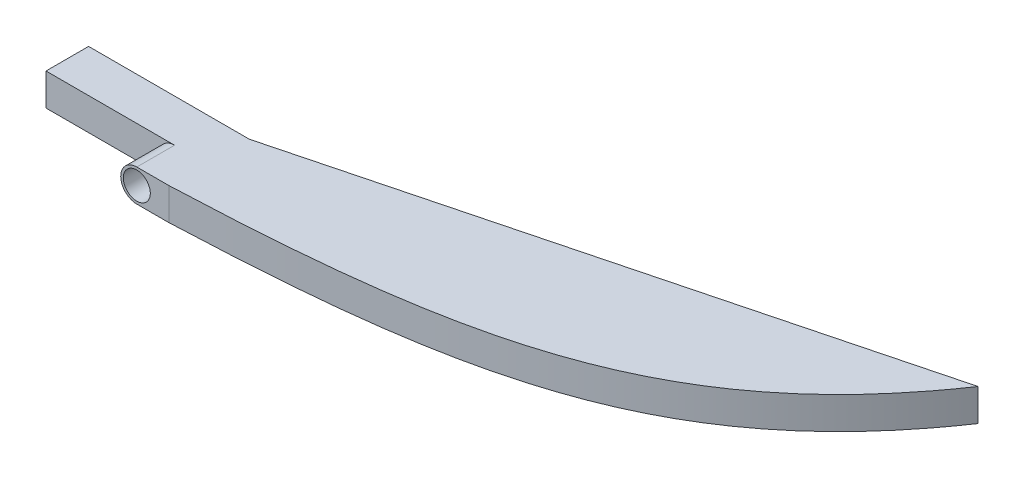
ISO-10303-21;
HEADER;
FILE_DESCRIPTION(('STEP AP214'),'2;1');
FILE_NAME('part.step','',(''),(''),'','','');
FILE_SCHEMA(('AUTOMOTIVE_DESIGN { 1 0 10303 214 1 1 1 1 }'));
ENDSEC;
DATA;
#1=APPLICATION_CONTEXT('core data for automotive mechanical design processes');
#2=APPLICATION_PROTOCOL_DEFINITION('international standard','automotive_design',2000,#1);
#3=PRODUCT_CONTEXT('',#1,'mechanical');
#4=PRODUCT('Part','Part','',(#3));
#5=PRODUCT_RELATED_PRODUCT_CATEGORY('part','',(#4));
#6=PRODUCT_DEFINITION_FORMATION('','',#4);
#7=PRODUCT_DEFINITION_CONTEXT('part definition',#1,'design');
#8=PRODUCT_DEFINITION('design','',#6,#7);
#9=PRODUCT_DEFINITION_SHAPE('','',#8);
#10=(LENGTH_UNIT() NAMED_UNIT(*) SI_UNIT(.MILLI.,.METRE.));
#11=(NAMED_UNIT(*) PLANE_ANGLE_UNIT() SI_UNIT($,.RADIAN.));
#12=(NAMED_UNIT(*) SI_UNIT($,.STERADIAN.) SOLID_ANGLE_UNIT());
#13=UNCERTAINTY_MEASURE_WITH_UNIT(LENGTH_MEASURE(1.E-05),#10,'distance_accuracy_value','');
#14=(GEOMETRIC_REPRESENTATION_CONTEXT(3) GLOBAL_UNCERTAINTY_ASSIGNED_CONTEXT((#13)) GLOBAL_UNIT_ASSIGNED_CONTEXT((#10,
#11,#12)) REPRESENTATION_CONTEXT('',''));
#15=CARTESIAN_POINT('',(0.,0.,0.));
#16=DIRECTION('',(0.,0.,1.));
#17=DIRECTION('',(1.,0.,0.));
#18=AXIS2_PLACEMENT_3D('',#15,#16,#17);
#19=CARTESIAN_POINT('',(0.,5.,0.));
#20=DIRECTION('',(0.,1.,0.));
#21=DIRECTION('',(0.,0.,1.));
#22=AXIS2_PLACEMENT_3D('',#19,#20,#21);
#23=PLANE('',#22);
#24=DIRECTION('',(-1.,0.,0.));
#25=VECTOR('',#24,1.);
#26=CARTESIAN_POINT('',(0.,5.,-5.875));
#27=LINE('',#26,#25);
#28=CARTESIAN_POINT('',(-5.,5.,-5.875));
#29=VERTEX_POINT('',#28);
#30=CARTESIAN_POINT('',(-25.,5.,-5.875));
#31=VERTEX_POINT('',#30);
#32=EDGE_CURVE('E51',#29,#31,#27,.T.);
#33=ORIENTED_EDGE('',*,*,#32,.F.);
#34=DIRECTION('',(0.,0.,1.));
#35=VECTOR('',#34,1.);
#36=CARTESIAN_POINT('',(-5.,5.,-5.875));
#37=LINE('',#36,#35);
#38=CARTESIAN_POINT('',(-5.,5.,0.));
#39=VERTEX_POINT('',#38);
#40=EDGE_CURVE('E102',#29,#39,#37,.T.);
#41=ORIENTED_EDGE('',*,*,#40,.T.);
#42=DIRECTION('',(1.,0.,0.));
#43=VECTOR('',#42,1.);
#44=CARTESIAN_POINT('',(-25.,5.,0.));
#45=LINE('',#44,#43);
#46=CARTESIAN_POINT('',(0.,5.,0.));
#47=VERTEX_POINT('',#46);
#48=EDGE_CURVE('E78',#39,#47,#45,.T.);
#49=ORIENTED_EDGE('',*,*,#48,.T.);
#50=CARTESIAN_POINT('',(9.68527644259352E-13,5.,0.));
#51=CARTESIAN_POINT('',(0.394136998698571,5.,-0.015797335774826));
#52=CARTESIAN_POINT('',(1.19495296634827,5.,-0.0488340451744374));
#53=CARTESIAN_POINT('',(2.9924488275803,5.,-0.125211317092621));
#54=CARTESIAN_POINT('',(4.57985606761734,5.,-0.200911655771645));
#55=CARTESIAN_POINT('',(6.61263735099886,5.,-0.301249970646708));
#56=CARTESIAN_POINT('',(8.39225173579563,5.,-0.398752477462649));
#57=CARTESIAN_POINT('',(10.3158780325456,5.,-0.509903004854173));
#58=CARTESIAN_POINT('',(12.1590488581689,5.,-0.626310038297874));
#59=CARTESIAN_POINT('',(14.5117367043059,5.,-0.785189542426716));
#60=CARTESIAN_POINT('',(17.3057175474928,5.,-0.994336582241799));
#61=CARTESIAN_POINT('',(20.1143980422333,5.,-1.2314721996505));
#62=CARTESIAN_POINT('',(22.9099051374178,5.,-1.4997766672866));
#63=CARTESIAN_POINT('',(25.7075404935678,5.,-1.79649348896231));
#64=CARTESIAN_POINT('',(29.4305210039473,5.,-2.23238068411249));
#65=CARTESIAN_POINT('',(34.4573189552186,5.,-2.92851632053862));
#66=CARTESIAN_POINT('',(39.917638308554,5.,-3.88805089955126));
#67=CARTESIAN_POINT('',(45.3269668853896,5.,-5.10508491568666));
#68=CARTESIAN_POINT('',(49.7699184930585,5.,-6.31907944343257));
#69=CARTESIAN_POINT('',(53.3461591554728,5.,-7.4480062039785));
#70=CARTESIAN_POINT('',(56.8702317662926,5.,-8.73099545644263));
#71=CARTESIAN_POINT('',(60.3296228282931,5.,-10.1800985563369));
#72=CARTESIAN_POINT('',(63.7102648370363,5.,-11.8049105173792));
#73=CARTESIAN_POINT('',(66.9975975917679,5.,-13.6114918141178));
#74=CARTESIAN_POINT('',(70.1773258697249,5.,-15.6015799192183));
#75=CARTESIAN_POINT('',(72.8542835868794,5.,-17.5008937092538));
#76=CARTESIAN_POINT('',(75.0672040776872,5.,-19.2370891591246));
#77=CARTESIAN_POINT('',(76.8547325054621,5.,-20.7525851322669));
#78=CARTESIAN_POINT('',(78.2501685733854,5.,-22.0046292242676));
#79=CARTESIAN_POINT('',(79.6197079738718,5.,-23.3032497684926));
#80=CARTESIAN_POINT('',(80.9623555969946,5.,-24.6474536181214));
#81=CARTESIAN_POINT('',(82.2773215060258,5.,-26.0360871147108));
#82=CARTESIAN_POINT('',(83.4031789305879,5.,-27.2888943209911));
#83=CARTESIAN_POINT('',(84.3453875712456,5.,-28.382707101818));
#84=CARTESIAN_POINT('',(85.1155330620901,5.,-29.3069028674258));
#85=CARTESIAN_POINT('',(85.7227153684007,5.,-30.0536236554861));
#86=CARTESIAN_POINT('',(86.3210254583511,5.,-30.8074219851701));
#87=CARTESIAN_POINT('',(86.9107122239662,5.,-31.5682804699309));
#88=CARTESIAN_POINT('',(87.4912553251952,5.,-32.3350400247342));
#89=CARTESIAN_POINT('',(88.0643121302846,5.,-33.1097551608932));
#90=CARTESIAN_POINT('',(88.6299361172786,5.,-33.8921081488089));
#91=CARTESIAN_POINT('',(89.0999032332647,5.,-34.5557401932857));
#92=CARTESIAN_POINT('',(89.5569559699906,5.,-35.2158292815368));
#93=CARTESIAN_POINT('',(89.8292929766433,5.,-35.6139091746178));
#94=CARTESIAN_POINT('',(89.9432469744588,5.,-35.7815692341193));
#95=CARTESIAN_POINT('',(90.0000000000007,5.,-35.8654273181337));
#96=B_SPLINE_CURVE_WITH_KNOTS('',4,(#50,#51,#52,#53,#54,#55,#56,#57,#58,#59,#60,#61,#62,#63,#64,
#65,#66,#67,#68,#69,#70,#71,#72,#73,#74,#75,#76,#77,#78,#79,#80,#81,#82,#83,#84,#85,#86,#87,#88,
#89,#90,#91,#92,#93,#94,#95),.UNSPECIFIED.,.F.,.F.,(5,1,1,1,1,1,1,1,1,1,1,1,1,1,1,1,1,1,1,1,1,1,
1,1,1,1,1,1,1,1,1,1,1,1,1,1,1,1,1,1,1,1,5),(0.0748229744830367,0.0903984077790677,
0.105973841075099,0.12154927437113,0.137124707667161,0.152700140929901,0.168275574192641,
0.183851007455381,0.199426440718121,0.230577306683844,0.261728172649567,0.277303606110959,
0.292879039572351,0.324029906495135,0.386331636273386,0.445924571490646,0.477075434078487,
0.50822630605085,0.539377158963895,0.570528010178799,0.601678867891275,0.632829681125078,
0.663980451014261,0.695131351715917,0.726282194003899,0.741857688091504,0.757433182179109,
0.773008671366096,0.788584160553083,0.804576905961795,0.820569651370507,0.836562506445381,
0.844558933982818,0.852555361520255,0.860551890959728,0.868548420399201,0.876544949838674,
0.884541479278147,0.892538010330116,0.900534541382085,0.908531072434054,0.912529337960039,
0.916527603486023),.UNSPECIFIED.);
#97=CARTESIAN_POINT('',(90.,5.,-35.8654273181327));
#98=VERTEX_POINT('',#97);
#99=EDGE_CURVE('E146',#47,#98,#96,.T.);
#100=ORIENTED_EDGE('',*,*,#99,.T.);
#101=DIRECTION('',(0.967912994794426,0.,-0.251285563668281));
#102=VECTOR('',#101,1.);
#103=CARTESIAN_POINT('',(-3.04028203098464,5.,-11.7106945686489));
#104=LINE('',#103,#102);
#105=CARTESIAN_POINT('',(0.,5.,-12.5));
#106=VERTEX_POINT('',#105);
#107=EDGE_CURVE('E151',#106,#98,#104,.T.);
#108=ORIENTED_EDGE('',*,*,#107,.F.);
#109=DIRECTION('',(1.,0.,0.));
#110=VECTOR('',#109,1.);
#111=CARTESIAN_POINT('',(-25.,5.,-12.5));
#112=LINE('',#111,#110);
#113=CARTESIAN_POINT('',(-25.,5.,-12.5));
#114=VERTEX_POINT('',#113);
#115=EDGE_CURVE('E142',#114,#106,#112,.T.);
#116=ORIENTED_EDGE('',*,*,#115,.F.);
#117=DIRECTION('',(0.,0.,-1.));
#118=VECTOR('',#117,1.);
#119=CARTESIAN_POINT('',(-25.,5.,-12.5));
#120=LINE('',#119,#118);
#121=EDGE_CURVE('E117',#31,#114,#120,.T.);
#122=ORIENTED_EDGE('',*,*,#121,.F.);
#123=EDGE_LOOP('',(#33,#41,#49,#100,#108,#116,#122));
#124=FACE_BOUND('',#123,.T.);
#125=ADVANCED_FACE('F35',(#124),#23,.T.);
#126=CARTESIAN_POINT('',(0.,0.,0.));
#127=DIRECTION('',(0.,1.,0.));
#128=DIRECTION('',(0.,0.,1.));
#129=AXIS2_PLACEMENT_3D('',#126,#127,#128);
#130=PLANE('',#129);
#131=DIRECTION('',(0.,0.,1.));
#132=VECTOR('',#131,1.);
#133=CARTESIAN_POINT('',(-5.,0.,-5.875));
#134=LINE('',#133,#132);
#135=CARTESIAN_POINT('',(-5.,0.,-5.875));
#136=VERTEX_POINT('',#135);
#137=CARTESIAN_POINT('',(-5.,0.,0.));
#138=VERTEX_POINT('',#137);
#139=EDGE_CURVE('E108',#136,#138,#134,.T.);
#140=ORIENTED_EDGE('',*,*,#139,.F.);
#141=DIRECTION('',(1.,0.,0.));
#142=VECTOR('',#141,1.);
#143=CARTESIAN_POINT('',(0.,0.,-5.875));
#144=LINE('',#143,#142);
#145=CARTESIAN_POINT('',(-25.,0.,-5.875));
#146=VERTEX_POINT('',#145);
#147=EDGE_CURVE('E109',#146,#136,#144,.T.);
#148=ORIENTED_EDGE('',*,*,#147,.F.);
#149=DIRECTION('',(0.,0.,1.));
#150=VECTOR('',#149,1.);
#151=CARTESIAN_POINT('',(-25.,0.,-12.5));
#152=LINE('',#151,#150);
#153=CARTESIAN_POINT('',(-25.,0.,-12.5));
#154=VERTEX_POINT('',#153);
#155=EDGE_CURVE('E134',#154,#146,#152,.T.);
#156=ORIENTED_EDGE('',*,*,#155,.F.);
#157=DIRECTION('',(1.,0.,0.));
#158=VECTOR('',#157,1.);
#159=CARTESIAN_POINT('',(-25.,0.,-12.5));
#160=LINE('',#159,#158);
#161=CARTESIAN_POINT('',(0.,0.,-12.5));
#162=VERTEX_POINT('',#161);
#163=EDGE_CURVE('E139',#154,#162,#160,.T.);
#164=ORIENTED_EDGE('',*,*,#163,.T.);
#165=DIRECTION('',(0.967912994794426,0.,-0.251285563668281));
#166=VECTOR('',#165,1.);
#167=CARTESIAN_POINT('',(-3.04028203098464,0.,-11.7106945686489));
#168=LINE('',#167,#166);
#169=CARTESIAN_POINT('',(90.,0.,-35.8654273181327));
#170=VERTEX_POINT('',#169);
#171=EDGE_CURVE('E152',#162,#170,#168,.T.);
#172=ORIENTED_EDGE('',*,*,#171,.T.);
#173=CARTESIAN_POINT('',(9.68527644259352E-13,0.,0.));
#174=CARTESIAN_POINT('',(0.394136998698571,0.,-0.015797335774826));
#175=CARTESIAN_POINT('',(1.19495296634827,0.,-0.0488340451744374));
#176=CARTESIAN_POINT('',(2.9924488275803,0.,-0.125211317092621));
#177=CARTESIAN_POINT('',(4.57985606761734,0.,-0.200911655771645));
#178=CARTESIAN_POINT('',(6.61263735099886,0.,-0.301249970646708));
#179=CARTESIAN_POINT('',(8.39225173579563,0.,-0.398752477462649));
#180=CARTESIAN_POINT('',(10.3158780325456,0.,-0.509903004854173));
#181=CARTESIAN_POINT('',(12.1590488581689,0.,-0.626310038297874));
#182=CARTESIAN_POINT('',(14.5117367043059,0.,-0.785189542426716));
#183=CARTESIAN_POINT('',(17.3057175474928,0.,-0.994336582241799));
#184=CARTESIAN_POINT('',(20.1143980422333,0.,-1.2314721996505));
#185=CARTESIAN_POINT('',(22.9099051374178,0.,-1.4997766672866));
#186=CARTESIAN_POINT('',(25.7075404935678,0.,-1.79649348896231));
#187=CARTESIAN_POINT('',(29.4305210039473,0.,-2.23238068411249));
#188=CARTESIAN_POINT('',(34.4573189552186,0.,-2.92851632053862));
#189=CARTESIAN_POINT('',(39.917638308554,0.,-3.88805089955126));
#190=CARTESIAN_POINT('',(45.3269668853896,0.,-5.10508491568666));
#191=CARTESIAN_POINT('',(49.7699184930585,0.,-6.31907944343257));
#192=CARTESIAN_POINT('',(53.3461591554728,0.,-7.4480062039785));
#193=CARTESIAN_POINT('',(56.8702317662926,0.,-8.73099545644263));
#194=CARTESIAN_POINT('',(60.3296228282931,0.,-10.1800985563369));
#195=CARTESIAN_POINT('',(63.7102648370363,0.,-11.8049105173792));
#196=CARTESIAN_POINT('',(66.9975975917679,0.,-13.6114918141178));
#197=CARTESIAN_POINT('',(70.1773258697249,0.,-15.6015799192183));
#198=CARTESIAN_POINT('',(72.8542835868794,0.,-17.5008937092538));
#199=CARTESIAN_POINT('',(75.0672040776872,0.,-19.2370891591246));
#200=CARTESIAN_POINT('',(76.8547325054621,0.,-20.7525851322669));
#201=CARTESIAN_POINT('',(78.2501685733854,0.,-22.0046292242676));
#202=CARTESIAN_POINT('',(79.6197079738718,0.,-23.3032497684926));
#203=CARTESIAN_POINT('',(80.9623555969946,0.,-24.6474536181214));
#204=CARTESIAN_POINT('',(82.2773215060258,0.,-26.0360871147108));
#205=CARTESIAN_POINT('',(83.4031789305879,0.,-27.2888943209911));
#206=CARTESIAN_POINT('',(84.3453875712456,0.,-28.382707101818));
#207=CARTESIAN_POINT('',(85.1155330620901,0.,-29.3069028674258));
#208=CARTESIAN_POINT('',(85.7227153684007,0.,-30.0536236554861));
#209=CARTESIAN_POINT('',(86.3210254583511,0.,-30.8074219851701));
#210=CARTESIAN_POINT('',(86.9107122239662,0.,-31.5682804699309));
#211=CARTESIAN_POINT('',(87.4912553251952,0.,-32.3350400247342));
#212=CARTESIAN_POINT('',(88.0643121302846,0.,-33.1097551608932));
#213=CARTESIAN_POINT('',(88.6299361172786,0.,-33.8921081488089));
#214=CARTESIAN_POINT('',(89.0999032332647,0.,-34.5557401932857));
#215=CARTESIAN_POINT('',(89.5569559699906,0.,-35.2158292815368));
#216=CARTESIAN_POINT('',(89.8292929766433,0.,-35.6139091746178));
#217=CARTESIAN_POINT('',(89.9432469744588,0.,-35.7815692341193));
#218=CARTESIAN_POINT('',(90.0000000000007,0.,-35.8654273181337));
#219=B_SPLINE_CURVE_WITH_KNOTS('',4,(#173,#174,#175,#176,#177,#178,#179,#180,#181,#182,#183,
#184,#185,#186,#187,#188,#189,#190,#191,#192,#193,#194,#195,#196,#197,#198,#199,#200,#201,#202,
#203,#204,#205,#206,#207,#208,#209,#210,#211,#212,#213,#214,#215,#216,#217,#218),.UNSPECIFIED.,
.F.,.F.,(5,1,1,1,1,1,1,1,1,1,1,1,1,1,1,1,1,1,1,1,1,1,1,1,1,1,1,1,1,1,1,1,1,1,1,1,1,1,1,1,1,1,5),
(0.0748229744830367,0.0903984077790677,0.105973841075099,0.12154927437113,0.137124707667161,
0.152700140929901,0.168275574192641,0.183851007455381,0.199426440718121,0.230577306683844,
0.261728172649567,0.277303606110959,0.292879039572351,0.324029906495135,0.386331636273386,
0.445924571490646,0.477075434078487,0.50822630605085,0.539377158963895,0.570528010178799,
0.601678867891275,0.632829681125078,0.663980451014261,0.695131351715917,0.726282194003899,
0.741857688091504,0.757433182179109,0.773008671366096,0.788584160553083,0.804576905961795,
0.820569651370507,0.836562506445381,0.844558933982818,0.852555361520255,0.860551890959728,
0.868548420399201,0.876544949838674,0.884541479278147,0.892538010330116,0.900534541382085,
0.908531072434054,0.912529337960039,0.916527603486023),.UNSPECIFIED.);
#220=CARTESIAN_POINT('',(0.,0.,0.));
#221=VERTEX_POINT('',#220);
#222=EDGE_CURVE('E145',#221,#170,#219,.T.);
#223=ORIENTED_EDGE('',*,*,#222,.F.);
#224=DIRECTION('',(1.,0.,0.));
#225=VECTOR('',#224,1.);
#226=CARTESIAN_POINT('',(-25.,0.,0.));
#227=LINE('',#226,#225);
#228=EDGE_CURVE('E137',#138,#221,#227,.T.);
#229=ORIENTED_EDGE('',*,*,#228,.F.);
#230=EDGE_LOOP('',(#140,#148,#156,#164,#172,#223,#229));
#231=FACE_BOUND('',#230,.T.);
#232=ADVANCED_FACE('F171',(#231),#130,.F.);
#233=CARTESIAN_POINT('',(-25.,0.,0.));
#234=DIRECTION('',(0.,0.,-1.));
#235=DIRECTION('',(0.,1.,0.));
#236=AXIS2_PLACEMENT_3D('',#233,#234,#235);
#237=PLANE('',#236);
#238=CARTESIAN_POINT('',(-5.,2.5,0.));
#239=DIRECTION('',(0.,0.,-1.));
#240=DIRECTION('',(-1.,0.,0.));
#241=AXIS2_PLACEMENT_3D('',#238,#239,#240);
#242=CIRCLE('',#241,2.1);
#243=CARTESIAN_POINT('',(-7.1,2.5,0.));
#244=VERTEX_POINT('',#243);
#245=EDGE_CURVE('E126',#244,#244,#242,.T.);
#246=ORIENTED_EDGE('',*,*,#245,.T.);
#247=EDGE_LOOP('',(#246));
#248=FACE_BOUND('',#247,.T.);
#249=CARTESIAN_POINT('',(-5.,2.5,0.));
#250=DIRECTION('',(0.,0.,1.));
#251=DIRECTION('',(1.,0.,0.));
#252=AXIS2_PLACEMENT_3D('',#249,#250,#251);
#253=CIRCLE('',#252,2.5);
#254=EDGE_CURVE('E107',#39,#138,#253,.T.);
#255=ORIENTED_EDGE('',*,*,#254,.T.);
#256=ORIENTED_EDGE('',*,*,#228,.T.);
#257=DIRECTION('',(0.,-1.,0.));
#258=VECTOR('',#257,1.);
#259=CARTESIAN_POINT('',(0.,5.,0.));
#260=LINE('',#259,#258);
#261=EDGE_CURVE('E11',#47,#221,#260,.T.);
#262=ORIENTED_EDGE('',*,*,#261,.F.);
#263=ORIENTED_EDGE('',*,*,#48,.F.);
#264=EDGE_LOOP('',(#255,#256,#262,#263));
#265=FACE_BOUND('',#264,.T.);
#266=ADVANCED_FACE('F191',(#248,#265),#237,.F.);
#267=CARTESIAN_POINT('',(-25.,0.,0.));
#268=DIRECTION('',(1.,0.,0.));
#269=DIRECTION('',(0.,0.,-1.));
#270=AXIS2_PLACEMENT_3D('',#267,#268,#269);
#271=PLANE('',#270);
#272=DIRECTION('',(0.,-1.,0.));
#273=VECTOR('',#272,1.);
#274=CARTESIAN_POINT('',(-25.,0.,-5.875));
#275=LINE('',#274,#273);
#276=EDGE_CURVE('E118',#31,#146,#275,.T.);
#277=ORIENTED_EDGE('',*,*,#276,.F.);
#278=ORIENTED_EDGE('',*,*,#121,.T.);
#279=DIRECTION('',(0.,-1.,0.));
#280=VECTOR('',#279,1.);
#281=CARTESIAN_POINT('',(-25.,0.,-12.5));
#282=LINE('',#281,#280);
#283=EDGE_CURVE('E132',#114,#154,#282,.T.);
#284=ORIENTED_EDGE('',*,*,#283,.T.);
#285=ORIENTED_EDGE('',*,*,#155,.T.);
#286=EDGE_LOOP('',(#277,#278,#284,#285));
#287=FACE_BOUND('',#286,.T.);
#288=ADVANCED_FACE('F174',(#287),#271,.F.);
#289=DIRECTION('',(0.,-1.,0.));
#290=VECTOR('',#289,1.);
#291=SURFACE_OF_LINEAR_EXTRUSION('',#96,#290);
#292=ORIENTED_EDGE('',*,*,#222,.T.);
#293=DIRECTION('',(0.,-1.,0.));
#294=VECTOR('',#293,1.);
#295=CARTESIAN_POINT('',(90.,5.,-35.8654273181327));
#296=LINE('',#295,#294);
#297=EDGE_CURVE('E44',#98,#170,#296,.T.);
#298=ORIENTED_EDGE('',*,*,#297,.F.);
#299=ORIENTED_EDGE('',*,*,#99,.F.);
#300=ORIENTED_EDGE('',*,*,#261,.T.);
#301=EDGE_LOOP('',(#292,#298,#299,#300));
#302=FACE_BOUND('',#301,.T.);
#303=ADVANCED_FACE('F37',(#302),#291,.F.);
#304=CARTESIAN_POINT('',(-3.04028203098464,5.,-11.7106945686489));
#305=DIRECTION('',(-0.251285563668281,0.,-0.967912994794426));
#306=DIRECTION('',(-0.967912994794426,0.,0.251285563668281));
#307=AXIS2_PLACEMENT_3D('',#304,#305,#306);
#308=PLANE('',#307);
#309=ORIENTED_EDGE('',*,*,#171,.F.);
#310=DIRECTION('',(0.,-1.,0.));
#311=VECTOR('',#310,1.);
#312=CARTESIAN_POINT('',(0.,5.,-12.5));
#313=LINE('',#312,#311);
#314=EDGE_CURVE('E60',#106,#162,#313,.T.);
#315=ORIENTED_EDGE('',*,*,#314,.F.);
#316=ORIENTED_EDGE('',*,*,#107,.T.);
#317=ORIENTED_EDGE('',*,*,#297,.T.);
#318=EDGE_LOOP('',(#309,#315,#316,#317));
#319=FACE_BOUND('',#318,.T.);
#320=ADVANCED_FACE('F175',(#319),#308,.T.);
#321=CARTESIAN_POINT('',(-25.,0.,-12.5));
#322=DIRECTION('',(0.,0.,1.));
#323=DIRECTION('',(1.,0.,0.));
#324=AXIS2_PLACEMENT_3D('',#321,#322,#323);
#325=PLANE('',#324);
#326=CARTESIAN_POINT('',(-5.,2.5,-12.5));
#327=DIRECTION('',(0.,0.,-1.));
#328=DIRECTION('',(-1.,0.,0.));
#329=AXIS2_PLACEMENT_3D('',#326,#327,#328);
#330=CIRCLE('',#329,2.1);
#331=CARTESIAN_POINT('',(-7.1,2.5,-12.5));
#332=VERTEX_POINT('',#331);
#333=EDGE_CURVE('E124',#332,#332,#330,.T.);
#334=ORIENTED_EDGE('',*,*,#333,.F.);
#335=EDGE_LOOP('',(#334));
#336=FACE_BOUND('',#335,.T.);
#337=ORIENTED_EDGE('',*,*,#314,.T.);
#338=ORIENTED_EDGE('',*,*,#163,.F.);
#339=ORIENTED_EDGE('',*,*,#283,.F.);
#340=ORIENTED_EDGE('',*,*,#115,.T.);
#341=EDGE_LOOP('',(#337,#338,#339,#340));
#342=FACE_BOUND('',#341,.T.);
#343=ADVANCED_FACE('F167',(#336,#342),#325,.F.);
#344=CARTESIAN_POINT('',(-5.,2.5,0.));
#345=DIRECTION('',(0.,0.,-1.));
#346=DIRECTION('',(-1.,0.,0.));
#347=AXIS2_PLACEMENT_3D('',#344,#345,#346);
#348=CYLINDRICAL_SURFACE('',#347,2.1);
#349=ORIENTED_EDGE('',*,*,#245,.F.);
#350=EDGE_LOOP('',(#349));
#351=FACE_BOUND('',#350,.T.);
#352=ORIENTED_EDGE('',*,*,#333,.T.);
#353=EDGE_LOOP('',(#352));
#354=FACE_BOUND('',#353,.T.);
#355=ADVANCED_FACE('F181',(#351,#354),#348,.F.);
#356=CARTESIAN_POINT('',(-5.,2.5,-5.875));
#357=DIRECTION('',(0.,0.,1.));
#358=DIRECTION('',(1.,0.,0.));
#359=AXIS2_PLACEMENT_3D('',#356,#357,#358);
#360=CYLINDRICAL_SURFACE('',#359,2.5);
#361=ORIENTED_EDGE('',*,*,#254,.F.);
#362=ORIENTED_EDGE('',*,*,#40,.F.);
#363=CARTESIAN_POINT('',(-5.,2.5,-5.875));
#364=DIRECTION('',(0.,0.,1.));
#365=DIRECTION('',(1.,0.,0.));
#366=AXIS2_PLACEMENT_3D('',#363,#364,#365);
#367=CIRCLE('',#366,2.5);
#368=EDGE_CURVE('E104',#29,#136,#367,.T.);
#369=ORIENTED_EDGE('',*,*,#368,.T.);
#370=ORIENTED_EDGE('',*,*,#139,.T.);
#371=EDGE_LOOP('',(#361,#362,#369,#370));
#372=FACE_BOUND('',#371,.T.);
#373=ADVANCED_FACE('F103',(#372),#360,.T.);
#374=CARTESIAN_POINT('',(0.,0.,-5.875));
#375=DIRECTION('',(0.,0.,1.));
#376=DIRECTION('',(1.,0.,0.));
#377=AXIS2_PLACEMENT_3D('',#374,#375,#376);
#378=PLANE('',#377);
#379=ORIENTED_EDGE('',*,*,#368,.F.);
#380=ORIENTED_EDGE('',*,*,#32,.T.);
#381=ORIENTED_EDGE('',*,*,#276,.T.);
#382=ORIENTED_EDGE('',*,*,#147,.T.);
#383=EDGE_LOOP('',(#379,#380,#381,#382));
#384=FACE_BOUND('',#383,.T.);
#385=ADVANCED_FACE('F111',(#384),#378,.T.);
#386=CLOSED_SHELL('',(#125,#232,#266,#288,#303,#320,#343,#355,#373,#385));
#387=MANIFOLD_SOLID_BREP('B2',#386);
#388=ADVANCED_BREP_SHAPE_REPRESENTATION('',(#18,#387),#14);
#389=SHAPE_DEFINITION_REPRESENTATION(#9,#388);
ENDSEC;
END-ISO-10303-21;
